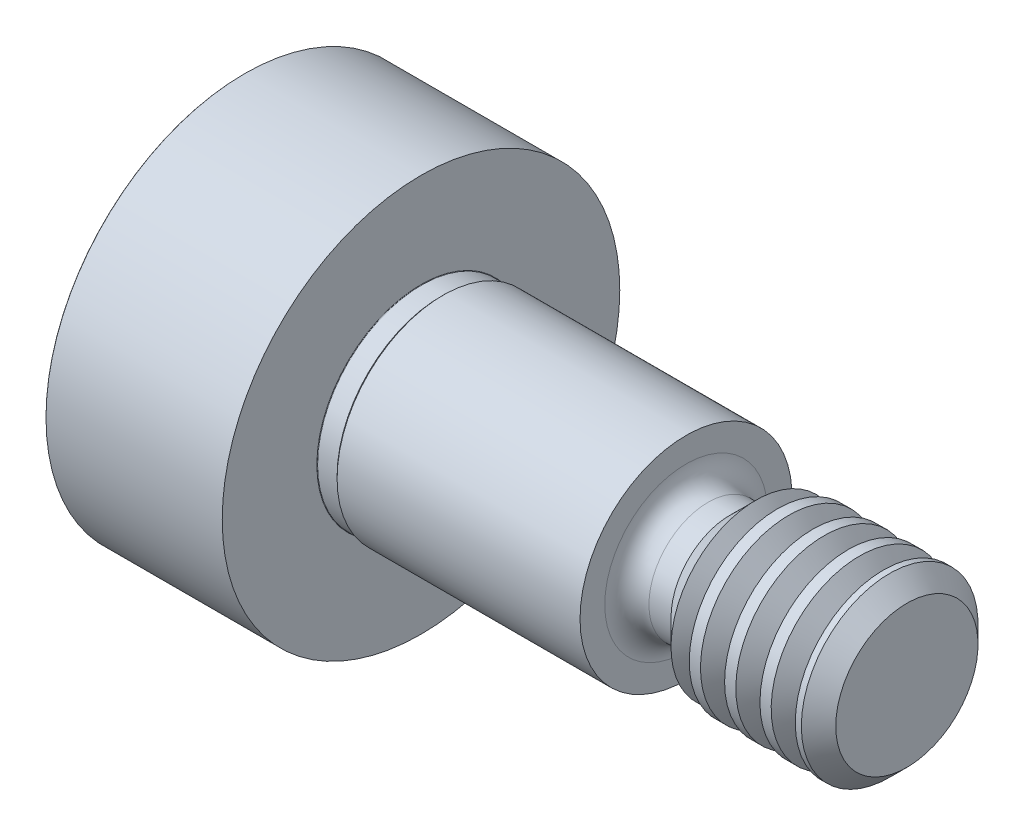
ISO-10303-21;
HEADER;
FILE_DESCRIPTION(('STEP AP214'),'2;1');
FILE_NAME('part.step','',(''),(''),'','','');
FILE_SCHEMA(('AUTOMOTIVE_DESIGN { 1 0 10303 214 1 1 1 1 }'));
ENDSEC;
DATA;
#1=APPLICATION_CONTEXT('core data for automotive mechanical design processes');
#2=APPLICATION_PROTOCOL_DEFINITION('international standard','automotive_design',2000,#1);
#3=PRODUCT_CONTEXT('',#1,'mechanical');
#4=PRODUCT('Part','Part','',(#3));
#5=PRODUCT_RELATED_PRODUCT_CATEGORY('part','',(#4));
#6=PRODUCT_DEFINITION_FORMATION('','',#4);
#7=PRODUCT_DEFINITION_CONTEXT('part definition',#1,'design');
#8=PRODUCT_DEFINITION('design','',#6,#7);
#9=PRODUCT_DEFINITION_SHAPE('','',#8);
#10=(LENGTH_UNIT() NAMED_UNIT(*) SI_UNIT(.MILLI.,.METRE.));
#11=(NAMED_UNIT(*) PLANE_ANGLE_UNIT() SI_UNIT($,.RADIAN.));
#12=(NAMED_UNIT(*) SI_UNIT($,.STERADIAN.) SOLID_ANGLE_UNIT());
#13=UNCERTAINTY_MEASURE_WITH_UNIT(LENGTH_MEASURE(1.E-05),#10,'distance_accuracy_value','');
#14=(GEOMETRIC_REPRESENTATION_CONTEXT(3) GLOBAL_UNCERTAINTY_ASSIGNED_CONTEXT((#13)) GLOBAL_UNIT_ASSIGNED_CONTEXT((#10,
#11,#12)) REPRESENTATION_CONTEXT('',''));
#15=CARTESIAN_POINT('',(0.,0.,0.));
#16=DIRECTION('',(0.,0.,1.));
#17=DIRECTION('',(1.,0.,0.));
#18=AXIS2_PLACEMENT_3D('',#15,#16,#17);
#19=CARTESIAN_POINT('',(0.,0.,0.));
#20=DIRECTION('',(-1.,0.,0.));
#21=DIRECTION('',(0.,0.,1.));
#22=AXIS2_PLACEMENT_3D('',#19,#20,#21);
#23=PLANE('',#22);
#24=CARTESIAN_POINT('',(0.,0.,0.));
#25=DIRECTION('',(-1.,0.,0.));
#26=DIRECTION('',(0.,0.,1.));
#27=AXIS2_PLACEMENT_3D('',#24,#25,#26);
#28=CIRCLE('',#27,4.49);
#29=CARTESIAN_POINT('',(0.,0.,4.49));
#30=VERTEX_POINT('',#29);
#31=EDGE_CURVE('E42',#30,#30,#28,.T.);
#32=ORIENTED_EDGE('',*,*,#31,.T.);
#33=EDGE_LOOP('',(#32));
#34=FACE_BOUND('',#33,.T.);
#35=DIRECTION('',(0.,-0.500000000000001,-0.866025403784438));
#36=VECTOR('',#35,1.);
#37=CARTESIAN_POINT('',(0.,-0.60044427995721,1.04));
#38=LINE('',#37,#36);
#39=CARTESIAN_POINT('',(0.,-0.60044427995721,1.04));
#40=VERTEX_POINT('',#39);
#41=CARTESIAN_POINT('',(0.,-1.20088855991442,0.));
#42=VERTEX_POINT('',#41);
#43=EDGE_CURVE('E105',#40,#42,#38,.T.);
#44=ORIENTED_EDGE('',*,*,#43,.T.);
#45=DIRECTION('',(0.,0.500000000000001,-0.866025403784438));
#46=VECTOR('',#45,1.);
#47=CARTESIAN_POINT('',(0.,-1.20088855991442,0.));
#48=LINE('',#47,#46);
#49=CARTESIAN_POINT('',(0.,-0.60044427995721,-1.04));
#50=VERTEX_POINT('',#49);
#51=EDGE_CURVE('E50',#42,#50,#48,.T.);
#52=ORIENTED_EDGE('',*,*,#51,.T.);
#53=DIRECTION('',(0.,1.,0.));
#54=VECTOR('',#53,1.);
#55=CARTESIAN_POINT('',(0.,-0.60044427995721,-1.04));
#56=LINE('',#55,#54);
#57=CARTESIAN_POINT('',(0.,0.60044427995721,-1.04));
#58=VERTEX_POINT('',#57);
#59=EDGE_CURVE('E109',#50,#58,#56,.T.);
#60=ORIENTED_EDGE('',*,*,#59,.T.);
#61=DIRECTION('',(0.,0.500000000000001,0.866025403784438));
#62=VECTOR('',#61,1.);
#63=CARTESIAN_POINT('',(0.,0.60044427995721,-1.04));
#64=LINE('',#63,#62);
#65=CARTESIAN_POINT('',(0.,1.20088855991442,0.));
#66=VERTEX_POINT('',#65);
#67=EDGE_CURVE('E200',#58,#66,#64,.T.);
#68=ORIENTED_EDGE('',*,*,#67,.T.);
#69=DIRECTION('',(0.,-0.500000000000001,0.866025403784438));
#70=VECTOR('',#69,1.);
#71=CARTESIAN_POINT('',(0.,1.20088855991442,0.));
#72=LINE('',#71,#70);
#73=CARTESIAN_POINT('',(0.,0.60044427995721,1.04));
#74=VERTEX_POINT('',#73);
#75=EDGE_CURVE('E203',#66,#74,#72,.T.);
#76=ORIENTED_EDGE('',*,*,#75,.T.);
#77=DIRECTION('',(0.,-1.,0.));
#78=VECTOR('',#77,1.);
#79=CARTESIAN_POINT('',(0.,0.60044427995721,1.04));
#80=LINE('',#79,#78);
#81=EDGE_CURVE('E206',#74,#40,#80,.T.);
#82=ORIENTED_EDGE('',*,*,#81,.T.);
#83=EDGE_LOOP('',(#44,#52,#60,#68,#76,#82));
#84=FACE_BOUND('',#83,.T.);
#85=ADVANCED_FACE('F33',(#34,#84),#23,.T.);
#86=CARTESIAN_POINT('',(-6.34999999999999,0.,0.));
#87=DIRECTION('',(-1.,0.,0.));
#88=DIRECTION('',(0.,0.,1.));
#89=AXIS2_PLACEMENT_3D('',#86,#87,#88);
#90=CYLINDRICAL_SURFACE('',#89,4.5);
#91=CARTESIAN_POINT('',(0.00999999999999959,0.,0.));
#92=DIRECTION('',(-1.,0.,0.));
#93=DIRECTION('',(0.,0.,1.));
#94=AXIS2_PLACEMENT_3D('',#91,#92,#93);
#95=CIRCLE('',#94,4.5);
#96=CARTESIAN_POINT('',(0.00999999999999959,0.,4.5));
#97=VERTEX_POINT('',#96);
#98=EDGE_CURVE('E11',#97,#97,#95,.F.);
#99=ORIENTED_EDGE('',*,*,#98,.T.);
#100=EDGE_LOOP('',(#99));
#101=FACE_BOUND('',#100,.T.);
#102=CARTESIAN_POINT('',(4.,0.,0.));
#103=DIRECTION('',(-1.,0.,0.));
#104=DIRECTION('',(0.,0.,1.));
#105=AXIS2_PLACEMENT_3D('',#102,#103,#104);
#106=CIRCLE('',#105,4.5);
#107=CARTESIAN_POINT('',(4.,0.,4.5));
#108=VERTEX_POINT('',#107);
#109=EDGE_CURVE('E149',#108,#108,#106,.T.);
#110=ORIENTED_EDGE('',*,*,#109,.T.);
#111=EDGE_LOOP('',(#110));
#112=FACE_BOUND('',#111,.T.);
#113=ADVANCED_FACE('F240',(#101,#112),#90,.T.);
#114=CARTESIAN_POINT('',(4.,4.5,0.));
#115=DIRECTION('',(1.,0.,0.));
#116=DIRECTION('',(0.,0.,-1.));
#117=AXIS2_PLACEMENT_3D('',#114,#115,#116);
#118=PLANE('',#117);
#119=CARTESIAN_POINT('',(4.,0.,0.));
#120=DIRECTION('',(-1.,0.,0.));
#121=DIRECTION('',(0.,0.,1.));
#122=AXIS2_PLACEMENT_3D('',#119,#120,#121);
#123=CIRCLE('',#122,2.36);
#124=CARTESIAN_POINT('',(4.,0.,2.36));
#125=VERTEX_POINT('',#124);
#126=EDGE_CURVE('E146',#125,#125,#123,.T.);
#127=ORIENTED_EDGE('',*,*,#126,.T.);
#128=EDGE_LOOP('',(#127));
#129=FACE_BOUND('',#128,.T.);
#130=ORIENTED_EDGE('',*,*,#109,.F.);
#131=EDGE_LOOP('',(#130));
#132=FACE_BOUND('',#131,.T.);
#133=ADVANCED_FACE('F245',(#129,#132),#118,.T.);
#134=CARTESIAN_POINT('',(4.01,0.,0.));
#135=DIRECTION('',(-1.,0.,0.));
#136=DIRECTION('',(0.,0.,1.));
#137=AXIS2_PLACEMENT_3D('',#134,#135,#136);
#138=TOROIDAL_SURFACE('',#137,2.36,0.00999999999999938);
#139=ORIENTED_EDGE('',*,*,#126,.F.);
#140=EDGE_LOOP('',(#139));
#141=FACE_BOUND('',#140,.T.);
#142=CARTESIAN_POINT('',(4.01,0.,0.));
#143=DIRECTION('',(-1.,0.,0.));
#144=DIRECTION('',(0.,0.,1.));
#145=AXIS2_PLACEMENT_3D('',#142,#143,#144);
#146=CIRCLE('',#145,2.35);
#147=CARTESIAN_POINT('',(4.01,0.,2.35));
#148=VERTEX_POINT('',#147);
#149=EDGE_CURVE('E143',#148,#148,#146,.T.);
#150=ORIENTED_EDGE('',*,*,#149,.T.);
#151=EDGE_LOOP('',(#150));
#152=FACE_BOUND('',#151,.T.);
#153=ADVANCED_FACE('F251',(#141,#152),#138,.F.);
#154=CARTESIAN_POINT('',(-6.34999999999999,0.,0.));
#155=DIRECTION('',(-1.,0.,0.));
#156=DIRECTION('',(0.,0.,1.));
#157=AXIS2_PLACEMENT_3D('',#154,#155,#156);
#158=CYLINDRICAL_SURFACE('',#157,2.35);
#159=CARTESIAN_POINT('',(4.45,0.,0.));
#160=DIRECTION('',(-1.,0.,0.));
#161=DIRECTION('',(0.,0.,1.));
#162=AXIS2_PLACEMENT_3D('',#159,#160,#161);
#163=CIRCLE('',#162,2.35);
#164=CARTESIAN_POINT('',(4.45,0.,2.35));
#165=VERTEX_POINT('',#164);
#166=EDGE_CURVE('E140',#165,#165,#163,.T.);
#167=ORIENTED_EDGE('',*,*,#166,.T.);
#168=EDGE_LOOP('',(#167));
#169=FACE_BOUND('',#168,.T.);
#170=ORIENTED_EDGE('',*,*,#149,.F.);
#171=EDGE_LOOP('',(#170));
#172=FACE_BOUND('',#171,.T.);
#173=ADVANCED_FACE('F255',(#169,#172),#158,.T.);
#174=CARTESIAN_POINT('',(4.45,0.,0.));
#175=DIRECTION('',(1.,0.,0.));
#176=DIRECTION('',(0.,0.,-1.));
#177=AXIS2_PLACEMENT_3D('',#174,#175,#176);
#178=CONICAL_SURFACE('',#177,2.35,0.785398163397444);
#179=CARTESIAN_POINT('',(4.5,0.,0.));
#180=DIRECTION('',(-1.,0.,0.));
#181=DIRECTION('',(0.,0.,1.));
#182=AXIS2_PLACEMENT_3D('',#179,#180,#181);
#183=CIRCLE('',#182,2.4);
#184=CARTESIAN_POINT('',(4.5,0.,2.4));
#185=VERTEX_POINT('',#184);
#186=EDGE_CURVE('E137',#185,#185,#183,.T.);
#187=ORIENTED_EDGE('',*,*,#186,.T.);
#188=EDGE_LOOP('',(#187));
#189=FACE_BOUND('',#188,.T.);
#190=ORIENTED_EDGE('',*,*,#166,.F.);
#191=EDGE_LOOP('',(#190));
#192=FACE_BOUND('',#191,.T.);
#193=ADVANCED_FACE('F259',(#189,#192),#178,.T.);
#194=CARTESIAN_POINT('',(-6.34999999999999,0.,0.));
#195=DIRECTION('',(-1.,0.,0.));
#196=DIRECTION('',(0.,0.,1.));
#197=AXIS2_PLACEMENT_3D('',#194,#195,#196);
#198=CYLINDRICAL_SURFACE('',#197,2.4);
#199=CARTESIAN_POINT('',(10.,0.,0.));
#200=DIRECTION('',(-1.,0.,0.));
#201=DIRECTION('',(0.,0.,1.));
#202=AXIS2_PLACEMENT_3D('',#199,#200,#201);
#203=CIRCLE('',#202,2.4);
#204=CARTESIAN_POINT('',(10.,0.,2.4));
#205=VERTEX_POINT('',#204);
#206=EDGE_CURVE('E134',#205,#205,#203,.T.);
#207=ORIENTED_EDGE('',*,*,#206,.T.);
#208=EDGE_LOOP('',(#207));
#209=FACE_BOUND('',#208,.T.);
#210=ORIENTED_EDGE('',*,*,#186,.F.);
#211=EDGE_LOOP('',(#210));
#212=FACE_BOUND('',#211,.T.);
#213=ADVANCED_FACE('F263',(#209,#212),#198,.T.);
#214=CARTESIAN_POINT('',(10.,2.4,0.));
#215=DIRECTION('',(1.,0.,0.));
#216=DIRECTION('',(0.,0.,-1.));
#217=AXIS2_PLACEMENT_3D('',#214,#215,#216);
#218=PLANE('',#217);
#219=CARTESIAN_POINT('',(10.,0.,0.));
#220=DIRECTION('',(-1.,0.,0.));
#221=DIRECTION('',(0.,0.,1.));
#222=AXIS2_PLACEMENT_3D('',#219,#220,#221);
#223=CIRCLE('',#222,1.84);
#224=CARTESIAN_POINT('',(10.,0.,1.84));
#225=VERTEX_POINT('',#224);
#226=EDGE_CURVE('E131',#225,#225,#223,.T.);
#227=ORIENTED_EDGE('',*,*,#226,.T.);
#228=EDGE_LOOP('',(#227));
#229=FACE_BOUND('',#228,.T.);
#230=ORIENTED_EDGE('',*,*,#206,.F.);
#231=EDGE_LOOP('',(#230));
#232=FACE_BOUND('',#231,.T.);
#233=ADVANCED_FACE('F267',(#229,#232),#218,.T.);
#234=CARTESIAN_POINT('',(10.5,0.,0.));
#235=DIRECTION('',(-1.,0.,0.));
#236=DIRECTION('',(0.,0.,1.));
#237=AXIS2_PLACEMENT_3D('',#234,#235,#236);
#238=TOROIDAL_SURFACE('',#237,1.84,0.500000000000002);
#239=CARTESIAN_POINT('',(10.5,0.,0.));
#240=DIRECTION('',(-1.,0.,0.));
#241=DIRECTION('',(0.,0.,1.));
#242=AXIS2_PLACEMENT_3D('',#239,#240,#241);
#243=CIRCLE('',#242,1.34);
#244=CARTESIAN_POINT('',(10.5,0.,1.34));
#245=VERTEX_POINT('',#244);
#246=EDGE_CURVE('E128',#245,#245,#243,.T.);
#247=ORIENTED_EDGE('',*,*,#246,.T.);
#248=EDGE_LOOP('',(#247));
#249=FACE_BOUND('',#248,.T.);
#250=ORIENTED_EDGE('',*,*,#226,.F.);
#251=EDGE_LOOP('',(#250));
#252=FACE_BOUND('',#251,.T.);
#253=ADVANCED_FACE('F271',(#249,#252),#238,.F.);
#254=CARTESIAN_POINT('',(-6.34999999999999,0.,0.));
#255=DIRECTION('',(-1.,0.,0.));
#256=DIRECTION('',(0.,0.,1.));
#257=AXIS2_PLACEMENT_3D('',#254,#255,#256);
#258=CYLINDRICAL_SURFACE('',#257,1.34);
#259=CARTESIAN_POINT('',(11.,0.,0.));
#260=DIRECTION('',(-1.,0.,0.));
#261=DIRECTION('',(0.,0.,1.));
#262=AXIS2_PLACEMENT_3D('',#259,#260,#261);
#263=CIRCLE('',#262,1.34);
#264=CARTESIAN_POINT('',(11.,0.,1.34));
#265=VERTEX_POINT('',#264);
#266=EDGE_CURVE('E125',#265,#265,#263,.T.);
#267=ORIENTED_EDGE('',*,*,#266,.T.);
#268=EDGE_LOOP('',(#267));
#269=FACE_BOUND('',#268,.T.);
#270=ORIENTED_EDGE('',*,*,#246,.F.);
#271=EDGE_LOOP('',(#270));
#272=FACE_BOUND('',#271,.T.);
#273=ADVANCED_FACE('F275',(#269,#272),#258,.T.);
#274=CARTESIAN_POINT('',(11.,0.,0.));
#275=DIRECTION('',(1.,0.,0.));
#276=DIRECTION('',(0.,0.,-1.));
#277=AXIS2_PLACEMENT_3D('',#274,#275,#276);
#278=CONICAL_SURFACE('',#277,1.34,0.785398163397448);
#279=CARTESIAN_POINT('',(11.5817266498877,0.,0.));
#280=DIRECTION('',(-1.,0.,0.));
#281=DIRECTION('',(0.,-1.,0.));
#282=AXIS2_PLACEMENT_3D('',#279,#280,#281);
#283=CIRCLE('',#282,1.92172664988774);
#284=CARTESIAN_POINT('',(11.5817266498877,-1.92172664988774,0.));
#285=VERTEX_POINT('',#284);
#286=EDGE_CURVE('E157',#285,#285,#283,.F.);
#287=ORIENTED_EDGE('',*,*,#286,.F.);
#288=EDGE_LOOP('',(#287));
#289=FACE_BOUND('',#288,.T.);
#290=ORIENTED_EDGE('',*,*,#266,.F.);
#291=EDGE_LOOP('',(#290));
#292=FACE_BOUND('',#291,.T.);
#293=ADVANCED_FACE('F279',(#289,#292),#278,.T.);
#294=CARTESIAN_POINT('',(0.,0.,0.));
#295=DIRECTION('',(1.,0.,0.));
#296=DIRECTION('',(0.,0.,-1.));
#297=AXIS2_PLACEMENT_3D('',#294,#295,#296);
#298=CONICAL_SURFACE('',#297,4.49,0.785398163397492);
#299=ORIENTED_EDGE('',*,*,#98,.F.);
#300=EDGE_LOOP('',(#299));
#301=FACE_BOUND('',#300,.T.);
#302=ORIENTED_EDGE('',*,*,#31,.F.);
#303=EDGE_LOOP('',(#302));
#304=FACE_BOUND('',#303,.T.);
#305=ADVANCED_FACE('F35',(#301,#304),#298,.T.);
#306=CARTESIAN_POINT('',(2.4,-1.20088855991442,0.));
#307=DIRECTION('',(0.,0.866025403784438,0.500000000000001));
#308=DIRECTION('',(0.,-0.500000000000001,0.866025403784438));
#309=AXIS2_PLACEMENT_3D('',#306,#307,#308);
#310=PLANE('',#309);
#311=ORIENTED_EDGE('',*,*,#51,.F.);
#312=DIRECTION('',(-1.,0.,0.));
#313=VECTOR('',#312,1.);
#314=CARTESIAN_POINT('',(2.4,-1.20088855991442,0.));
#315=LINE('',#314,#313);
#316=CARTESIAN_POINT('',(2.4,-1.20088855991442,0.));
#317=VERTEX_POINT('',#316);
#318=EDGE_CURVE('E104',#317,#42,#315,.T.);
#319=ORIENTED_EDGE('',*,*,#318,.F.);
#320=DIRECTION('',(0.,0.500000000000001,-0.866025403784438));
#321=VECTOR('',#320,1.);
#322=CARTESIAN_POINT('',(2.4,-1.20088855991442,0.));
#323=LINE('',#322,#321);
#324=CARTESIAN_POINT('',(2.4,-0.60044427995721,-1.04));
#325=VERTEX_POINT('',#324);
#326=EDGE_CURVE('E94',#317,#325,#323,.T.);
#327=ORIENTED_EDGE('',*,*,#326,.T.);
#328=DIRECTION('',(-1.,0.,0.));
#329=VECTOR('',#328,1.);
#330=CARTESIAN_POINT('',(2.4,-0.60044427995721,-1.04));
#331=LINE('',#330,#329);
#332=EDGE_CURVE('E103',#325,#50,#331,.T.);
#333=ORIENTED_EDGE('',*,*,#332,.T.);
#334=EDGE_LOOP('',(#311,#319,#327,#333));
#335=FACE_BOUND('',#334,.T.);
#336=ADVANCED_FACE('F102',(#335),#310,.T.);
#337=CARTESIAN_POINT('',(2.4,-0.60044427995721,-1.04));
#338=DIRECTION('',(0.,0.,1.));
#339=DIRECTION('',(0.,-1.,0.));
#340=AXIS2_PLACEMENT_3D('',#337,#338,#339);
#341=PLANE('',#340);
#342=ORIENTED_EDGE('',*,*,#59,.F.);
#343=ORIENTED_EDGE('',*,*,#332,.F.);
#344=DIRECTION('',(0.,1.,0.));
#345=VECTOR('',#344,1.);
#346=CARTESIAN_POINT('',(2.4,-0.60044427995721,-1.04));
#347=LINE('',#346,#345);
#348=CARTESIAN_POINT('',(2.4,0.60044427995721,-1.04));
#349=VERTEX_POINT('',#348);
#350=EDGE_CURVE('E90',#325,#349,#347,.T.);
#351=ORIENTED_EDGE('',*,*,#350,.T.);
#352=DIRECTION('',(-1.,0.,0.));
#353=VECTOR('',#352,1.);
#354=CARTESIAN_POINT('',(2.4,0.60044427995721,-1.04));
#355=LINE('',#354,#353);
#356=EDGE_CURVE('E111',#349,#58,#355,.T.);
#357=ORIENTED_EDGE('',*,*,#356,.T.);
#358=EDGE_LOOP('',(#342,#343,#351,#357));
#359=FACE_BOUND('',#358,.T.);
#360=ADVANCED_FACE('F107',(#359),#341,.T.);
#361=CARTESIAN_POINT('',(2.4,0.60044427995721,-1.04));
#362=DIRECTION('',(0.,-0.866025403784438,0.500000000000001));
#363=DIRECTION('',(0.,-0.500000000000001,-0.866025403784438));
#364=AXIS2_PLACEMENT_3D('',#361,#362,#363);
#365=PLANE('',#364);
#366=ORIENTED_EDGE('',*,*,#67,.F.);
#367=ORIENTED_EDGE('',*,*,#356,.F.);
#368=DIRECTION('',(0.,0.500000000000001,0.866025403784438));
#369=VECTOR('',#368,1.);
#370=CARTESIAN_POINT('',(2.4,0.60044427995721,-1.04));
#371=LINE('',#370,#369);
#372=CARTESIAN_POINT('',(2.4,1.20088855991442,0.));
#373=VERTEX_POINT('',#372);
#374=EDGE_CURVE('E96',#349,#373,#371,.T.);
#375=ORIENTED_EDGE('',*,*,#374,.T.);
#376=DIRECTION('',(-1.,0.,0.));
#377=VECTOR('',#376,1.);
#378=CARTESIAN_POINT('',(2.4,1.20088855991442,0.));
#379=LINE('',#378,#377);
#380=EDGE_CURVE('E116',#373,#66,#379,.T.);
#381=ORIENTED_EDGE('',*,*,#380,.T.);
#382=EDGE_LOOP('',(#366,#367,#375,#381));
#383=FACE_BOUND('',#382,.T.);
#384=ADVANCED_FACE('F220',(#383),#365,.T.);
#385=CARTESIAN_POINT('',(2.4,1.20088855991442,0.));
#386=DIRECTION('',(0.,-0.866025403784438,-0.500000000000001));
#387=DIRECTION('',(0.,0.500000000000001,-0.866025403784438));
#388=AXIS2_PLACEMENT_3D('',#385,#386,#387);
#389=PLANE('',#388);
#390=ORIENTED_EDGE('',*,*,#75,.F.);
#391=ORIENTED_EDGE('',*,*,#380,.F.);
#392=DIRECTION('',(0.,-0.500000000000001,0.866025403784438));
#393=VECTOR('',#392,1.);
#394=CARTESIAN_POINT('',(2.4,1.20088855991442,0.));
#395=LINE('',#394,#393);
#396=CARTESIAN_POINT('',(2.4,0.60044427995721,1.04));
#397=VERTEX_POINT('',#396);
#398=EDGE_CURVE('E192',#373,#397,#395,.T.);
#399=ORIENTED_EDGE('',*,*,#398,.T.);
#400=DIRECTION('',(-1.,0.,0.));
#401=VECTOR('',#400,1.);
#402=CARTESIAN_POINT('',(2.4,0.60044427995721,1.04));
#403=LINE('',#402,#401);
#404=EDGE_CURVE('E215',#397,#74,#403,.T.);
#405=ORIENTED_EDGE('',*,*,#404,.T.);
#406=EDGE_LOOP('',(#390,#391,#399,#405));
#407=FACE_BOUND('',#406,.T.);
#408=ADVANCED_FACE('F230',(#407),#389,.T.);
#409=CARTESIAN_POINT('',(2.4,0.60044427995721,1.04));
#410=DIRECTION('',(0.,0.,-1.));
#411=DIRECTION('',(-1.,0.,0.));
#412=AXIS2_PLACEMENT_3D('',#409,#410,#411);
#413=PLANE('',#412);
#414=ORIENTED_EDGE('',*,*,#81,.F.);
#415=ORIENTED_EDGE('',*,*,#404,.F.);
#416=DIRECTION('',(0.,-1.,0.));
#417=VECTOR('',#416,1.);
#418=CARTESIAN_POINT('',(2.4,0.60044427995721,1.04));
#419=LINE('',#418,#417);
#420=CARTESIAN_POINT('',(2.4,-0.60044427995721,1.04));
#421=VERTEX_POINT('',#420);
#422=EDGE_CURVE('E194',#397,#421,#419,.T.);
#423=ORIENTED_EDGE('',*,*,#422,.T.);
#424=DIRECTION('',(-1.,0.,0.));
#425=VECTOR('',#424,1.);
#426=CARTESIAN_POINT('',(2.4,-0.60044427995721,1.04));
#427=LINE('',#426,#425);
#428=EDGE_CURVE('E212',#421,#40,#427,.T.);
#429=ORIENTED_EDGE('',*,*,#428,.T.);
#430=EDGE_LOOP('',(#414,#415,#423,#429));
#431=FACE_BOUND('',#430,.T.);
#432=ADVANCED_FACE('F227',(#431),#413,.T.);
#433=CARTESIAN_POINT('',(2.4,-0.60044427995721,1.04));
#434=DIRECTION('',(0.,0.866025403784438,-0.500000000000001));
#435=DIRECTION('',(0.,0.500000000000001,0.866025403784438));
#436=AXIS2_PLACEMENT_3D('',#433,#434,#435);
#437=PLANE('',#436);
#438=ORIENTED_EDGE('',*,*,#43,.F.);
#439=ORIENTED_EDGE('',*,*,#428,.F.);
#440=DIRECTION('',(0.,-0.500000000000001,-0.866025403784438));
#441=VECTOR('',#440,1.);
#442=CARTESIAN_POINT('',(2.4,-0.60044427995721,1.04));
#443=LINE('',#442,#441);
#444=EDGE_CURVE('E196',#421,#317,#443,.T.);
#445=ORIENTED_EDGE('',*,*,#444,.T.);
#446=ORIENTED_EDGE('',*,*,#318,.T.);
#447=EDGE_LOOP('',(#438,#439,#445,#446));
#448=FACE_BOUND('',#447,.T.);
#449=ADVANCED_FACE('F225',(#448),#437,.T.);
#450=CARTESIAN_POINT('',(2.4,0.,-2.07999999999999));
#451=DIRECTION('',(1.,0.,0.));
#452=DIRECTION('',(0.,0.,-1.));
#453=AXIS2_PLACEMENT_3D('',#450,#451,#452);
#454=PLANE('',#453);
#455=CARTESIAN_POINT('',(2.4,0.,0.));
#456=DIRECTION('',(1.,0.,0.));
#457=DIRECTION('',(0.,0.,-1.));
#458=AXIS2_PLACEMENT_3D('',#455,#456,#457);
#459=CIRCLE('',#458,0.347179676972457);
#460=CARTESIAN_POINT('',(2.4,0.,-0.347179676972457));
#461=VERTEX_POINT('',#460);
#462=EDGE_CURVE('E110',#461,#461,#459,.T.);
#463=ORIENTED_EDGE('',*,*,#462,.T.);
#464=EDGE_LOOP('',(#463));
#465=FACE_BOUND('',#464,.T.);
#466=ORIENTED_EDGE('',*,*,#326,.F.);
#467=ORIENTED_EDGE('',*,*,#444,.F.);
#468=ORIENTED_EDGE('',*,*,#422,.F.);
#469=ORIENTED_EDGE('',*,*,#398,.F.);
#470=ORIENTED_EDGE('',*,*,#374,.F.);
#471=ORIENTED_EDGE('',*,*,#350,.F.);
#472=EDGE_LOOP('',(#466,#467,#468,#469,#470,#471));
#473=FACE_BOUND('',#472,.T.);
#474=ADVANCED_FACE('F92',(#465,#473),#454,.F.);
#475=CARTESIAN_POINT('',(2.60044427995722,0.,0.));
#476=DIRECTION('',(-1.,0.,0.));
#477=DIRECTION('',(0.,0.,1.));
#478=AXIS2_PLACEMENT_3D('',#475,#476,#477);
#479=CONICAL_SURFACE('',#478,0.,1.04719755119659);
#480=ORIENTED_EDGE('',*,*,#462,.F.);
#481=EDGE_LOOP('',(#480));
#482=FACE_BOUND('',#481,.T.);
#483=CARTESIAN_POINT('',(2.60044427995722,0.,0.));
#484=VERTEX_POINT('',#483);
#485=VERTEX_LOOP('',#484);
#486=FACE_BOUND('',#485,.T.);
#487=ADVANCED_FACE('F301',(#482,#486),#479,.F.);
#488=CARTESIAN_POINT('',(12.3531639551857,0.,0.));
#489=DIRECTION('',(1.,0.,0.));
#490=DIRECTION('',(0.,1.,0.));
#491=AXIS2_PLACEMENT_3D('',#488,#489,#490);
#492=CONICAL_SURFACE('',#491,2.4,0.959931088596884);
#493=CARTESIAN_POINT('',(12.0730809399018,0.,0.));
#494=DIRECTION('',(1.,0.,0.));
#495=DIRECTION('',(0.,1.,0.));
#496=AXIS2_PLACEMENT_3D('',#493,#494,#495);
#497=CIRCLE('',#496,2.);
#498=CARTESIAN_POINT('',(12.0730809399018,2.,0.));
#499=VERTEX_POINT('',#498);
#500=EDGE_CURVE('E154',#499,#499,#497,.F.);
#501=ORIENTED_EDGE('',*,*,#500,.T.);
#502=EDGE_LOOP('',(#501));
#503=FACE_BOUND('',#502,.T.);
#504=CARTESIAN_POINT('',(11.8,0.,0.));
#505=DIRECTION('',(-1.,0.,0.));
#506=DIRECTION('',(0.,-1.,0.));
#507=AXIS2_PLACEMENT_3D('',#504,#505,#506);
#508=CIRCLE('',#507,1.61);
#509=CARTESIAN_POINT('',(11.8,-1.61,0.));
#510=VERTEX_POINT('',#509);
#511=EDGE_CURVE('E158',#510,#510,#508,.T.);
#512=ORIENTED_EDGE('',*,*,#511,.F.);
#513=EDGE_LOOP('',(#512));
#514=FACE_BOUND('',#513,.T.);
#515=ADVANCED_FACE('F304',(#503,#514),#492,.T.);
#516=CARTESIAN_POINT('',(11.8,0.,0.));
#517=DIRECTION('',(-1.,0.,0.));
#518=DIRECTION('',(0.,-1.,0.));
#519=AXIS2_PLACEMENT_3D('',#516,#517,#518);
#520=CONICAL_SURFACE('',#519,1.61,0.959931088596877);
#521=ORIENTED_EDGE('',*,*,#286,.T.);
#522=EDGE_LOOP('',(#521));
#523=FACE_BOUND('',#522,.T.);
#524=ORIENTED_EDGE('',*,*,#511,.T.);
#525=EDGE_LOOP('',(#524));
#526=FACE_BOUND('',#525,.T.);
#527=ADVANCED_FACE('F288',(#523,#526),#520,.T.);
#528=CARTESIAN_POINT('',(-6.34999999999999,0.,0.));
#529=DIRECTION('',(-1.,0.,0.));
#530=DIRECTION('',(0.,0.,1.));
#531=AXIS2_PLACEMENT_3D('',#528,#529,#530);
#532=CYLINDRICAL_SURFACE('',#531,2.);
#533=CARTESIAN_POINT('',(12.3269190600982,0.,0.));
#534=DIRECTION('',(-1.,0.,0.));
#535=DIRECTION('',(0.,-1.,0.));
#536=AXIS2_PLACEMENT_3D('',#533,#534,#535);
#537=CIRCLE('',#536,2.);
#538=CARTESIAN_POINT('',(12.3269190600982,-2.,0.));
#539=VERTEX_POINT('',#538);
#540=EDGE_CURVE('E161',#539,#539,#537,.F.);
#541=ORIENTED_EDGE('',*,*,#540,.F.);
#542=EDGE_LOOP('',(#541));
#543=FACE_BOUND('',#542,.T.);
#544=ORIENTED_EDGE('',*,*,#500,.F.);
#545=EDGE_LOOP('',(#544));
#546=FACE_BOUND('',#545,.T.);
#547=ADVANCED_FACE('F284',(#543,#546),#532,.T.);
#548=CARTESIAN_POINT('',(13.1531639551857,0.,0.));
#549=DIRECTION('',(1.,0.,0.));
#550=DIRECTION('',(0.,1.,0.));
#551=AXIS2_PLACEMENT_3D('',#548,#549,#550);
#552=CONICAL_SURFACE('',#551,2.4,0.959931088596884);
#553=CARTESIAN_POINT('',(12.8730809399018,0.,0.));
#554=DIRECTION('',(1.,0.,0.));
#555=DIRECTION('',(0.,1.,0.));
#556=AXIS2_PLACEMENT_3D('',#553,#554,#555);
#557=CIRCLE('',#556,2.);
#558=CARTESIAN_POINT('',(12.8730809399018,2.,0.));
#559=VERTEX_POINT('',#558);
#560=EDGE_CURVE('E164',#559,#559,#557,.F.);
#561=ORIENTED_EDGE('',*,*,#560,.T.);
#562=EDGE_LOOP('',(#561));
#563=FACE_BOUND('',#562,.T.);
#564=CARTESIAN_POINT('',(12.6,0.,0.));
#565=DIRECTION('',(-1.,0.,0.));
#566=DIRECTION('',(0.,-1.,0.));
#567=AXIS2_PLACEMENT_3D('',#564,#565,#566);
#568=CIRCLE('',#567,1.61);
#569=CARTESIAN_POINT('',(12.6,-1.61,0.));
#570=VERTEX_POINT('',#569);
#571=EDGE_CURVE('E165',#570,#570,#568,.T.);
#572=ORIENTED_EDGE('',*,*,#571,.F.);
#573=EDGE_LOOP('',(#572));
#574=FACE_BOUND('',#573,.T.);
#575=ADVANCED_FACE('F287',(#563,#574),#552,.T.);
#576=CARTESIAN_POINT('',(12.6,0.,0.));
#577=DIRECTION('',(-1.,0.,0.));
#578=DIRECTION('',(0.,-1.,0.));
#579=AXIS2_PLACEMENT_3D('',#576,#577,#578);
#580=CONICAL_SURFACE('',#579,1.61,0.959931088596877);
#581=ORIENTED_EDGE('',*,*,#540,.T.);
#582=EDGE_LOOP('',(#581));
#583=FACE_BOUND('',#582,.T.);
#584=ORIENTED_EDGE('',*,*,#571,.T.);
#585=EDGE_LOOP('',(#584));
#586=FACE_BOUND('',#585,.T.);
#587=ADVANCED_FACE('F395',(#583,#586),#580,.T.);
#588=CARTESIAN_POINT('',(13.1269190600982,0.,0.));
#589=DIRECTION('',(-1.,0.,0.));
#590=DIRECTION('',(0.,-1.,0.));
#591=AXIS2_PLACEMENT_3D('',#588,#589,#590);
#592=CIRCLE('',#591,2.);
#593=CARTESIAN_POINT('',(13.1269190600982,-2.,0.));
#594=VERTEX_POINT('',#593);
#595=EDGE_CURVE('E168',#594,#594,#592,.F.);
#596=ORIENTED_EDGE('',*,*,#595,.F.);
#597=EDGE_LOOP('',(#596));
#598=FACE_BOUND('',#597,.T.);
#599=ORIENTED_EDGE('',*,*,#560,.F.);
#600=EDGE_LOOP('',(#599));
#601=FACE_BOUND('',#600,.T.);
#602=ADVANCED_FACE('F291',(#598,#601),#532,.T.);
#603=CARTESIAN_POINT('',(13.9531639551857,0.,0.));
#604=DIRECTION('',(1.,0.,0.));
#605=DIRECTION('',(0.,1.,0.));
#606=AXIS2_PLACEMENT_3D('',#603,#604,#605);
#607=CONICAL_SURFACE('',#606,2.4,0.959931088596884);
#608=CARTESIAN_POINT('',(13.6730809399018,0.,0.));
#609=DIRECTION('',(1.,0.,0.));
#610=DIRECTION('',(0.,1.,0.));
#611=AXIS2_PLACEMENT_3D('',#608,#609,#610);
#612=CIRCLE('',#611,2.);
#613=CARTESIAN_POINT('',(13.6730809399018,2.,0.));
#614=VERTEX_POINT('',#613);
#615=EDGE_CURVE('E171',#614,#614,#612,.F.);
#616=ORIENTED_EDGE('',*,*,#615,.T.);
#617=EDGE_LOOP('',(#616));
#618=FACE_BOUND('',#617,.T.);
#619=CARTESIAN_POINT('',(13.4,0.,0.));
#620=DIRECTION('',(-1.,0.,0.));
#621=DIRECTION('',(0.,-1.,0.));
#622=AXIS2_PLACEMENT_3D('',#619,#620,#621);
#623=CIRCLE('',#622,1.61);
#624=CARTESIAN_POINT('',(13.4,-1.61,0.));
#625=VERTEX_POINT('',#624);
#626=EDGE_CURVE('E172',#625,#625,#623,.T.);
#627=ORIENTED_EDGE('',*,*,#626,.F.);
#628=EDGE_LOOP('',(#627));
#629=FACE_BOUND('',#628,.T.);
#630=ADVANCED_FACE('F415',(#618,#629),#607,.T.);
#631=CARTESIAN_POINT('',(13.4,0.,0.));
#632=DIRECTION('',(-1.,0.,0.));
#633=DIRECTION('',(0.,-1.,0.));
#634=AXIS2_PLACEMENT_3D('',#631,#632,#633);
#635=CONICAL_SURFACE('',#634,1.61,0.959931088596877);
#636=ORIENTED_EDGE('',*,*,#595,.T.);
#637=EDGE_LOOP('',(#636));
#638=FACE_BOUND('',#637,.T.);
#639=ORIENTED_EDGE('',*,*,#626,.T.);
#640=EDGE_LOOP('',(#639));
#641=FACE_BOUND('',#640,.T.);
#642=ADVANCED_FACE('F425',(#638,#641),#635,.T.);
#643=CARTESIAN_POINT('',(13.9269190600982,0.,0.));
#644=DIRECTION('',(-1.,0.,0.));
#645=DIRECTION('',(0.,-1.,0.));
#646=AXIS2_PLACEMENT_3D('',#643,#644,#645);
#647=CIRCLE('',#646,2.);
#648=CARTESIAN_POINT('',(13.9269190600982,-2.,0.));
#649=VERTEX_POINT('',#648);
#650=EDGE_CURVE('E174',#649,#649,#647,.F.);
#651=ORIENTED_EDGE('',*,*,#650,.F.);
#652=EDGE_LOOP('',(#651));
#653=FACE_BOUND('',#652,.T.);
#654=ORIENTED_EDGE('',*,*,#615,.F.);
#655=EDGE_LOOP('',(#654));
#656=FACE_BOUND('',#655,.T.);
#657=ADVANCED_FACE('F417',(#653,#656),#532,.T.);
#658=CARTESIAN_POINT('',(14.7531639551857,0.,0.));
#659=DIRECTION('',(1.,0.,0.));
#660=DIRECTION('',(0.,1.,0.));
#661=AXIS2_PLACEMENT_3D('',#658,#659,#660);
#662=CONICAL_SURFACE('',#661,2.4,0.959931088596884);
#663=CARTESIAN_POINT('',(14.4730809399018,0.,0.));
#664=DIRECTION('',(1.,0.,0.));
#665=DIRECTION('',(0.,1.,0.));
#666=AXIS2_PLACEMENT_3D('',#663,#664,#665);
#667=CIRCLE('',#666,2.);
#668=CARTESIAN_POINT('',(14.4730809399018,2.,0.));
#669=VERTEX_POINT('',#668);
#670=EDGE_CURVE('E37',#669,#669,#667,.F.);
#671=ORIENTED_EDGE('',*,*,#670,.T.);
#672=EDGE_LOOP('',(#671));
#673=FACE_BOUND('',#672,.T.);
#674=CARTESIAN_POINT('',(14.2,0.,0.));
#675=DIRECTION('',(-1.,0.,0.));
#676=DIRECTION('',(0.,-1.,0.));
#677=AXIS2_PLACEMENT_3D('',#674,#675,#676);
#678=CIRCLE('',#677,1.61);
#679=CARTESIAN_POINT('',(14.2,-1.61,0.));
#680=VERTEX_POINT('',#679);
#681=EDGE_CURVE('E176',#680,#680,#678,.T.);
#682=ORIENTED_EDGE('',*,*,#681,.F.);
#683=EDGE_LOOP('',(#682));
#684=FACE_BOUND('',#683,.T.);
#685=ADVANCED_FACE('F444',(#673,#684),#662,.T.);
#686=CARTESIAN_POINT('',(14.2,0.,0.));
#687=DIRECTION('',(-1.,0.,0.));
#688=DIRECTION('',(0.,-1.,0.));
#689=AXIS2_PLACEMENT_3D('',#686,#687,#688);
#690=CONICAL_SURFACE('',#689,1.61,0.959931088596877);
#691=ORIENTED_EDGE('',*,*,#650,.T.);
#692=EDGE_LOOP('',(#691));
#693=FACE_BOUND('',#692,.T.);
#694=ORIENTED_EDGE('',*,*,#681,.T.);
#695=EDGE_LOOP('',(#694));
#696=FACE_BOUND('',#695,.T.);
#697=ADVANCED_FACE('F299',(#693,#696),#690,.T.);
#698=CARTESIAN_POINT('',(15.,1.61,0.));
#699=DIRECTION('',(1.,0.,0.));
#700=DIRECTION('',(0.,0.,-1.));
#701=AXIS2_PLACEMENT_3D('',#698,#699,#700);
#702=PLANE('',#701);
#703=CARTESIAN_POINT('',(15.,0.,0.));
#704=DIRECTION('',(-1.,0.,0.));
#705=DIRECTION('',(0.,0.,1.));
#706=AXIS2_PLACEMENT_3D('',#703,#704,#705);
#707=CIRCLE('',#706,1.61);
#708=CARTESIAN_POINT('',(15.,0.,1.61));
#709=VERTEX_POINT('',#708);
#710=EDGE_CURVE('E114',#709,#709,#707,.T.);
#711=ORIENTED_EDGE('',*,*,#710,.F.);
#712=EDGE_LOOP('',(#711));
#713=FACE_BOUND('',#712,.T.);
#714=ADVANCED_FACE('F295',(#713),#702,.T.);
#715=CARTESIAN_POINT('',(14.61,0.,0.));
#716=DIRECTION('',(-1.,0.,0.));
#717=DIRECTION('',(0.,0.,1.));
#718=AXIS2_PLACEMENT_3D('',#715,#716,#717);
#719=CONICAL_SURFACE('',#718,2.,0.785398163397454);
#720=ORIENTED_EDGE('',*,*,#710,.T.);
#721=EDGE_LOOP('',(#720));
#722=FACE_BOUND('',#721,.T.);
#723=CARTESIAN_POINT('',(14.61,0.,0.));
#724=DIRECTION('',(-1.,0.,0.));
#725=DIRECTION('',(0.,0.,1.));
#726=AXIS2_PLACEMENT_3D('',#723,#724,#725);
#727=CIRCLE('',#726,2.);
#728=CARTESIAN_POINT('',(14.61,0.,2.));
#729=VERTEX_POINT('',#728);
#730=EDGE_CURVE('E122',#729,#729,#727,.T.);
#731=ORIENTED_EDGE('',*,*,#730,.F.);
#732=EDGE_LOOP('',(#731));
#733=FACE_BOUND('',#732,.T.);
#734=ADVANCED_FACE('F292',(#722,#733),#719,.T.);
#735=ORIENTED_EDGE('',*,*,#670,.F.);
#736=EDGE_LOOP('',(#735));
#737=FACE_BOUND('',#736,.T.);
#738=ORIENTED_EDGE('',*,*,#730,.T.);
#739=EDGE_LOOP('',(#738));
#740=FACE_BOUND('',#739,.T.);
#741=ADVANCED_FACE('F290',(#737,#740),#532,.T.);
#742=CLOSED_SHELL('',(#85,#113,#133,#153,#173,#193,#213,#233,#253,#273,#293,#305,#336,#360,#384,
#408,#432,#449,#474,#487,#515,#527,#547,#575,#587,#602,#630,#642,#657,#685,#697,#714,#734,#741));
#743=MANIFOLD_SOLID_BREP('B2',#742);
#744=ADVANCED_BREP_SHAPE_REPRESENTATION('',(#18,#743),#14);
#745=SHAPE_DEFINITION_REPRESENTATION(#9,#744);
ENDSEC;
END-ISO-10303-21;
